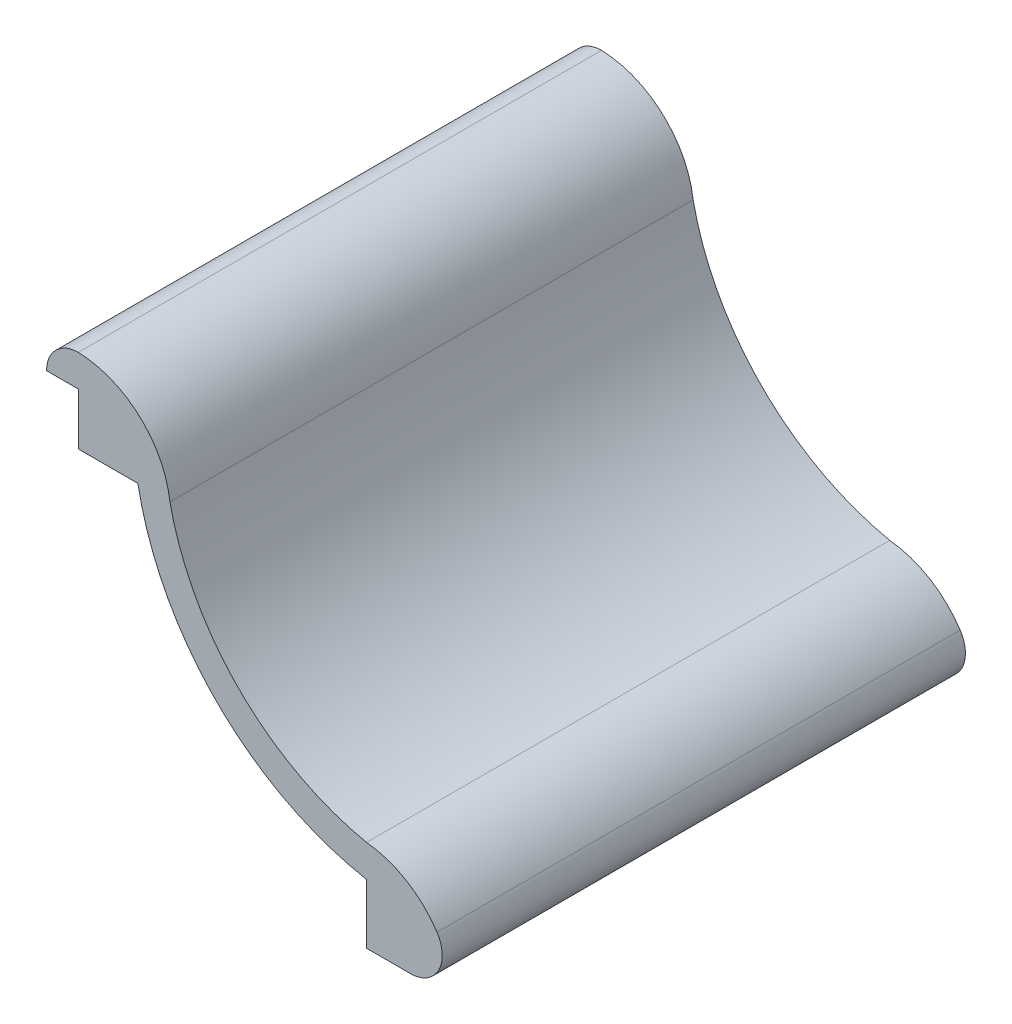
ISO-10303-21;
HEADER;
FILE_DESCRIPTION(('STEP AP214'),'2;1');
FILE_NAME('part.step','',(''),(''),'','','');
FILE_SCHEMA(('AUTOMOTIVE_DESIGN { 1 0 10303 214 1 1 1 1 }'));
ENDSEC;
DATA;
#1=APPLICATION_CONTEXT('core data for automotive mechanical design processes');
#2=APPLICATION_PROTOCOL_DEFINITION('international standard','automotive_design',2000,#1);
#3=PRODUCT_CONTEXT('',#1,'mechanical');
#4=PRODUCT('Part','Part','',(#3));
#5=PRODUCT_RELATED_PRODUCT_CATEGORY('part','',(#4));
#6=PRODUCT_DEFINITION_FORMATION('','',#4);
#7=PRODUCT_DEFINITION_CONTEXT('part definition',#1,'design');
#8=PRODUCT_DEFINITION('design','',#6,#7);
#9=PRODUCT_DEFINITION_SHAPE('','',#8);
#10=(LENGTH_UNIT() NAMED_UNIT(*) SI_UNIT(.MILLI.,.METRE.));
#11=(NAMED_UNIT(*) PLANE_ANGLE_UNIT() SI_UNIT($,.RADIAN.));
#12=(NAMED_UNIT(*) SI_UNIT($,.STERADIAN.) SOLID_ANGLE_UNIT());
#13=UNCERTAINTY_MEASURE_WITH_UNIT(LENGTH_MEASURE(1.E-05),#10,'distance_accuracy_value','');
#14=(GEOMETRIC_REPRESENTATION_CONTEXT(3) GLOBAL_UNCERTAINTY_ASSIGNED_CONTEXT((#13)) GLOBAL_UNIT_ASSIGNED_CONTEXT((#10,
#11,#12)) REPRESENTATION_CONTEXT('',''));
#15=CARTESIAN_POINT('',(0.,0.,0.));
#16=DIRECTION('',(0.,0.,1.));
#17=DIRECTION('',(1.,0.,0.));
#18=AXIS2_PLACEMENT_3D('',#15,#16,#17);
#19=CARTESIAN_POINT('',(-3.15197105507584,-11.938,-104.775));
#20=DIRECTION('',(0.,1.,0.));
#21=DIRECTION('',(0.,0.,1.));
#22=AXIS2_PLACEMENT_3D('',#19,#20,#21);
#23=PLANE('',#22);
#24=DIRECTION('',(-1.,0.,0.));
#25=VECTOR('',#24,1.);
#26=CARTESIAN_POINT('',(-3.15197105507584,-11.938,0.));
#27=LINE('',#26,#25);
#28=CARTESIAN_POINT('',(8.80657813501905,-11.938,0.));
#29=VERTEX_POINT('',#28);
#30=CARTESIAN_POINT('',(0.,-11.938,0.));
#31=VERTEX_POINT('',#30);
#32=EDGE_CURVE('E235',#29,#31,#27,.T.);
#33=ORIENTED_EDGE('',*,*,#32,.F.);
#34=DIRECTION('',(0.,0.,1.));
#35=VECTOR('',#34,1.);
#36=CARTESIAN_POINT('',(8.80657813501905,-11.938,104.775));
#37=LINE('',#36,#35);
#38=CARTESIAN_POINT('',(8.80657813501905,-11.938,92.5957));
#39=VERTEX_POINT('',#38);
#40=EDGE_CURVE('E325',#29,#39,#37,.T.);
#41=ORIENTED_EDGE('',*,*,#40,.T.);
#42=DIRECTION('',(1.,0.,0.));
#43=VECTOR('',#42,1.);
#44=CARTESIAN_POINT('',(-1.80789407603243,-11.938,92.5957));
#45=LINE('',#44,#43);
#46=CARTESIAN_POINT('',(0.,-11.938,92.5957));
#47=VERTEX_POINT('',#46);
#48=EDGE_CURVE('E243',#47,#39,#45,.T.);
#49=ORIENTED_EDGE('',*,*,#48,.F.);
#50=DIRECTION('',(0.,0.,1.));
#51=VECTOR('',#50,1.);
#52=CARTESIAN_POINT('',(0.,-11.938,92.5957));
#53=LINE('',#52,#51);
#54=EDGE_CURVE('E246',#31,#47,#53,.T.);
#55=ORIENTED_EDGE('',*,*,#54,.F.);
#56=EDGE_LOOP('',(#33,#41,#49,#55));
#57=FACE_BOUND('',#56,.T.);
#58=ADVANCED_FACE('F60',(#57),#23,.F.);
#59=CARTESIAN_POINT('',(-57.7342,44.7636331488296,-104.775));
#60=DIRECTION('',(1.,0.,0.));
#61=DIRECTION('',(0.,0.,-1.));
#62=AXIS2_PLACEMENT_3D('',#59,#60,#61);
#63=PLANE('',#62);
#64=DIRECTION('',(0.,0.,1.));
#65=VECTOR('',#64,1.);
#66=CARTESIAN_POINT('',(-57.7342,56.197173041991,0.));
#67=LINE('',#66,#65);
#68=CARTESIAN_POINT('',(-57.7342,56.197173041991,0.));
#69=VERTEX_POINT('',#68);
#70=CARTESIAN_POINT('',(-57.7342,56.197173041991,92.5957));
#71=VERTEX_POINT('',#70);
#72=EDGE_CURVE('E199',#69,#71,#67,.T.);
#73=ORIENTED_EDGE('',*,*,#72,.F.);
#74=DIRECTION('',(0.,1.,0.));
#75=VECTOR('',#74,1.);
#76=CARTESIAN_POINT('',(-57.7342,44.7636331488296,0.));
#77=LINE('',#76,#75);
#78=CARTESIAN_POINT('',(-57.7342,45.796198295609,0.));
#79=VERTEX_POINT('',#78);
#80=EDGE_CURVE('E215',#79,#69,#77,.T.);
#81=ORIENTED_EDGE('',*,*,#80,.F.);
#82=DIRECTION('',(0.,0.,-1.));
#83=VECTOR('',#82,1.);
#84=CARTESIAN_POINT('',(-57.7342,45.796198295609,92.5957));
#85=LINE('',#84,#83);
#86=CARTESIAN_POINT('',(-57.7342,45.796198295609,92.5957));
#87=VERTEX_POINT('',#86);
#88=EDGE_CURVE('E256',#87,#79,#85,.T.);
#89=ORIENTED_EDGE('',*,*,#88,.F.);
#90=DIRECTION('',(0.,-1.,0.));
#91=VECTOR('',#90,1.);
#92=CARTESIAN_POINT('',(-57.7342,43.4795574980974,92.5957));
#93=LINE('',#92,#91);
#94=EDGE_CURVE('E253',#71,#87,#93,.T.);
#95=ORIENTED_EDGE('',*,*,#94,.F.);
#96=EDGE_LOOP('',(#73,#81,#89,#95));
#97=FACE_BOUND('',#96,.T.);
#98=ADVANCED_FACE('F374',(#97),#63,.F.);
#99=CARTESIAN_POINT('',(-57.7342,56.197173041991,98.425));
#100=VERTEX_POINT('',#99);
#101=CARTESIAN_POINT('',(-57.7342,56.197173041991,104.775));
#102=VERTEX_POINT('',#101);
#103=EDGE_CURVE('E322',#100,#102,#67,.T.);
#104=ORIENTED_EDGE('',*,*,#103,.F.);
#105=DIRECTION('',(0.,-1.,0.));
#106=VECTOR('',#105,1.);
#107=CARTESIAN_POINT('',(-57.7342,43.479557498097,98.425));
#108=LINE('',#107,#106);
#109=CARTESIAN_POINT('',(-57.7342,45.796198295609,98.425));
#110=VERTEX_POINT('',#109);
#111=EDGE_CURVE('E319',#100,#110,#108,.T.);
#112=ORIENTED_EDGE('',*,*,#111,.T.);
#113=DIRECTION('',(0.,0.,1.));
#114=VECTOR('',#113,1.);
#115=CARTESIAN_POINT('',(-57.7342,45.796198365176,98.425));
#116=LINE('',#115,#114);
#117=CARTESIAN_POINT('',(-57.7342,45.7961983303925,104.775));
#118=VERTEX_POINT('',#117);
#119=EDGE_CURVE('E248',#110,#118,#116,.T.);
#120=ORIENTED_EDGE('',*,*,#119,.T.);
#121=DIRECTION('',(0.,1.,0.));
#122=VECTOR('',#121,1.);
#123=CARTESIAN_POINT('',(-57.7342,44.7636331488296,104.775));
#124=LINE('',#123,#122);
#125=EDGE_CURVE('E238',#118,#102,#124,.T.);
#126=ORIENTED_EDGE('',*,*,#125,.T.);
#127=EDGE_LOOP('',(#104,#112,#120,#126));
#128=FACE_BOUND('',#127,.T.);
#129=ADVANCED_FACE('F424',(#128),#63,.F.);
#130=CARTESIAN_POINT('',(10.3996216396257,56.1958216396257,104.775));
#131=DIRECTION('',(0.,0.,-1.));
#132=DIRECTION('',(-1.,0.,0.));
#133=AXIS2_PLACEMENT_3D('',#130,#131,#132);
#134=CYLINDRICAL_SURFACE('',#133,50.8493081391342);
#135=DIRECTION('',(0.,0.,-1.));
#136=VECTOR('',#135,1.);
#137=CARTESIAN_POINT('',(0.,6.42133010047239,104.775));
#138=LINE('',#137,#136);
#139=CARTESIAN_POINT('',(0.,6.42133010047239,104.775));
#140=VERTEX_POINT('',#139);
#141=CARTESIAN_POINT('',(0.,6.42133010047239,0.));
#142=VERTEX_POINT('',#141);
#143=EDGE_CURVE('E302',#140,#142,#138,.T.);
#144=ORIENTED_EDGE('',*,*,#143,.T.);
#145=CARTESIAN_POINT('',(10.3996216396257,56.1958216396257,0.));
#146=DIRECTION('',(0.,0.,-1.));
#147=DIRECTION('',(-1.,0.,0.));
#148=AXIS2_PLACEMENT_3D('',#145,#146,#147);
#149=CIRCLE('',#148,50.8493081391342);
#150=CARTESIAN_POINT('',(-39.3748698995276,45.7962,0.));
#151=VERTEX_POINT('',#150);
#152=EDGE_CURVE('E228',#142,#151,#149,.T.);
#153=ORIENTED_EDGE('',*,*,#152,.T.);
#154=DIRECTION('',(0.,0.,-1.));
#155=VECTOR('',#154,1.);
#156=CARTESIAN_POINT('',(-39.3748698995276,45.7962,104.775));
#157=LINE('',#156,#155);
#158=CARTESIAN_POINT('',(-39.3748698995276,45.7962,104.775));
#159=VERTEX_POINT('',#158);
#160=EDGE_CURVE('E303',#159,#151,#157,.T.);
#161=ORIENTED_EDGE('',*,*,#160,.F.);
#162=CARTESIAN_POINT('',(10.3996216396257,56.1958216396257,104.775));
#163=DIRECTION('',(0.,0.,1.));
#164=DIRECTION('',(1.,0.,0.));
#165=AXIS2_PLACEMENT_3D('',#162,#163,#164);
#166=CIRCLE('',#165,50.8493081391342);
#167=EDGE_CURVE('E292',#159,#140,#166,.T.);
#168=ORIENTED_EDGE('',*,*,#167,.T.);
#169=EDGE_LOOP('',(#144,#153,#161,#168));
#170=FACE_BOUND('',#169,.T.);
#171=ADVANCED_FACE('F396',(#170),#134,.F.);
#172=CARTESIAN_POINT('',(-58.3144927056739,43.4795574980971,104.775));
#173=DIRECTION('',(0.,0.,-1.));
#174=DIRECTION('',(-1.,0.,0.));
#175=AXIS2_PLACEMENT_3D('',#172,#173,#174);
#176=CYLINDRICAL_SURFACE('',#175,19.0807794526513);
#177=ORIENTED_EDGE('',*,*,#160,.T.);
#178=CARTESIAN_POINT('',(-58.3144927056739,43.4795574980971,0.));
#179=DIRECTION('',(0.,0.,-1.));
#180=DIRECTION('',(-1.,0.,0.));
#181=AXIS2_PLACEMENT_3D('',#178,#179,#180);
#182=CIRCLE('',#181,19.0807794526513);
#183=CARTESIAN_POINT('',(-57.7342,62.5515108562736,0.));
#184=VERTEX_POINT('',#183);
#185=EDGE_CURVE('E225',#151,#184,#182,.F.);
#186=ORIENTED_EDGE('',*,*,#185,.T.);
#187=DIRECTION('',(0.,0.,-1.));
#188=VECTOR('',#187,1.);
#189=CARTESIAN_POINT('',(-57.7342,62.5515108562736,104.775));
#190=LINE('',#189,#188);
#191=CARTESIAN_POINT('',(-57.7342,62.5515108562736,104.775));
#192=VERTEX_POINT('',#191);
#193=EDGE_CURVE('E259',#192,#184,#190,.T.);
#194=ORIENTED_EDGE('',*,*,#193,.F.);
#195=CARTESIAN_POINT('',(-58.3144927056739,43.4795574980971,104.775));
#196=DIRECTION('',(0.,0.,-1.));
#197=DIRECTION('',(-1.,0.,0.));
#198=AXIS2_PLACEMENT_3D('',#195,#196,#197);
#199=CIRCLE('',#198,19.0807794526513);
#200=EDGE_CURVE('E300',#192,#159,#199,.T.);
#201=ORIENTED_EDGE('',*,*,#200,.T.);
#202=EDGE_LOOP('',(#177,#186,#194,#201));
#203=FACE_BOUND('',#202,.T.);
#204=ADVANCED_FACE('F391',(#203),#176,.T.);
#205=CARTESIAN_POINT('',(10.3996216396257,56.1958216396257,104.775));
#206=DIRECTION('',(0.,0.,-1.));
#207=DIRECTION('',(-1.,0.,0.));
#208=AXIS2_PLACEMENT_3D('',#205,#206,#207);
#209=CYLINDRICAL_SURFACE('',#208,57.15);
#210=DIRECTION('',(0.,0.,-1.));
#211=VECTOR('',#210,1.);
#212=CARTESIAN_POINT('',(-45.7961996845846,45.796198295609,92.5957));
#213=LINE('',#212,#211);
#214=CARTESIAN_POINT('',(-45.7961996845846,45.796198295609,92.5957));
#215=VERTEX_POINT('',#214);
#216=CARTESIAN_POINT('',(-45.7961996845846,45.796198295609,0.));
#217=VERTEX_POINT('',#216);
#218=EDGE_CURVE('E289',#215,#217,#213,.T.);
#219=ORIENTED_EDGE('',*,*,#218,.T.);
#220=CARTESIAN_POINT('',(10.3996216396257,56.1958216396257,0.));
#221=DIRECTION('',(0.,0.,-1.));
#222=DIRECTION('',(-1.,0.,0.));
#223=AXIS2_PLACEMENT_3D('',#220,#221,#222);
#224=CIRCLE('',#223,57.15);
#225=CARTESIAN_POINT('',(0.,0.,0.));
#226=VERTEX_POINT('',#225);
#227=EDGE_CURVE('E218',#217,#226,#224,.F.);
#228=ORIENTED_EDGE('',*,*,#227,.T.);
#229=DIRECTION('',(0.,0.,-1.));
#230=VECTOR('',#229,1.);
#231=CARTESIAN_POINT('',(0.,0.,92.5957));
#232=LINE('',#231,#230);
#233=CARTESIAN_POINT('',(0.,0.,92.5957));
#234=VERTEX_POINT('',#233);
#235=EDGE_CURVE('E281',#234,#226,#232,.T.);
#236=ORIENTED_EDGE('',*,*,#235,.F.);
#237=DIRECTION('',(0.,0.,-1.));
#238=VECTOR('',#237,1.);
#239=CARTESIAN_POINT('',(0.,0.,104.775));
#240=LINE('',#239,#238);
#241=CARTESIAN_POINT('',(0.,0.,98.425));
#242=VERTEX_POINT('',#241);
#243=EDGE_CURVE('E314',#242,#234,#240,.T.);
#244=ORIENTED_EDGE('',*,*,#243,.F.);
#245=CARTESIAN_POINT('',(0.,0.,104.775));
#246=VERTEX_POINT('',#245);
#247=EDGE_CURVE('E311',#246,#242,#240,.T.);
#248=ORIENTED_EDGE('',*,*,#247,.F.);
#249=CARTESIAN_POINT('',(10.3996216396257,56.1958216396257,104.775));
#250=DIRECTION('',(0.,0.,-1.));
#251=DIRECTION('',(-1.,0.,0.));
#252=AXIS2_PLACEMENT_3D('',#249,#250,#251);
#253=CIRCLE('',#252,57.15);
#254=CARTESIAN_POINT('',(-45.7962,45.7962,104.775));
#255=VERTEX_POINT('',#254);
#256=EDGE_CURVE('E297',#246,#255,#253,.T.);
#257=ORIENTED_EDGE('',*,*,#256,.T.);
#258=DIRECTION('',(0.,0.,-1.));
#259=VECTOR('',#258,1.);
#260=CARTESIAN_POINT('',(-45.7962,45.7962,104.775));
#261=LINE('',#260,#259);
#262=CARTESIAN_POINT('',(-45.7962,45.7962,98.425));
#263=VERTEX_POINT('',#262);
#264=EDGE_CURVE('E307',#255,#263,#261,.T.);
#265=ORIENTED_EDGE('',*,*,#264,.T.);
#266=EDGE_CURVE('E310',#263,#215,#261,.T.);
#267=ORIENTED_EDGE('',*,*,#266,.T.);
#268=EDGE_LOOP('',(#219,#228,#236,#244,#248,#257,#265,#267));
#269=FACE_BOUND('',#268,.T.);
#270=ADVANCED_FACE('F365',(#269),#209,.T.);
#271=CARTESIAN_POINT('',(-1.87934056653368,-12.6385492205695,104.775));
#272=DIRECTION('',(0.,0.,-1.));
#273=DIRECTION('',(-1.,0.,0.));
#274=AXIS2_PLACEMENT_3D('',#271,#272,#273);
#275=CYLINDRICAL_SURFACE('',#274,19.1523084952624);
#276=CARTESIAN_POINT('',(-1.87934056653368,-12.6385492205695,104.775));
#277=DIRECTION('',(0.,0.,-1.));
#278=DIRECTION('',(-1.,0.,0.));
#279=AXIS2_PLACEMENT_3D('',#276,#277,#278);
#280=CIRCLE('',#279,19.1523084952624);
#281=CARTESIAN_POINT('',(14.106839707373,-2.09089730424912,104.775));
#282=VERTEX_POINT('',#281);
#283=EDGE_CURVE('E295',#140,#282,#280,.T.);
#284=ORIENTED_EDGE('',*,*,#283,.T.);
#285=DIRECTION('',(0.,0.,-1.));
#286=VECTOR('',#285,1.);
#287=CARTESIAN_POINT('',(14.106839707373,-2.09089730424912,104.775));
#288=LINE('',#287,#286);
#289=CARTESIAN_POINT('',(14.106839707373,-2.09089730424912,0.));
#290=VERTEX_POINT('',#289);
#291=EDGE_CURVE('E82',#282,#290,#288,.T.);
#292=ORIENTED_EDGE('',*,*,#291,.T.);
#293=CARTESIAN_POINT('',(-1.87934056653368,-12.6385492205695,0.));
#294=DIRECTION('',(0.,0.,-1.));
#295=DIRECTION('',(-1.,0.,0.));
#296=AXIS2_PLACEMENT_3D('',#293,#294,#295);
#297=CIRCLE('',#296,19.1523084952624);
#298=EDGE_CURVE('E233',#290,#142,#297,.F.);
#299=ORIENTED_EDGE('',*,*,#298,.T.);
#300=ORIENTED_EDGE('',*,*,#143,.F.);
#301=EDGE_LOOP('',(#284,#292,#299,#300));
#302=FACE_BOUND('',#301,.T.);
#303=ADVANCED_FACE('F397',(#302),#275,.T.);
#304=CARTESIAN_POINT('',(-58.2422,45.796198295609,92.5957));
#305=DIRECTION('',(0.,1.,0.));
#306=DIRECTION('',(-1.,0.,0.));
#307=AXIS2_PLACEMENT_3D('',#304,#305,#306);
#308=PLANE('',#307);
#309=DIRECTION('',(-1.,0.,0.));
#310=VECTOR('',#309,1.);
#311=CARTESIAN_POINT('',(-58.2422,45.796198295609,0.));
#312=LINE('',#311,#310);
#313=EDGE_CURVE('E216',#217,#79,#312,.T.);
#314=ORIENTED_EDGE('',*,*,#313,.F.);
#315=ORIENTED_EDGE('',*,*,#218,.F.);
#316=DIRECTION('',(1.,0.,0.));
#317=VECTOR('',#316,1.);
#318=CARTESIAN_POINT('',(-58.2422,45.796198295609,92.5957));
#319=LINE('',#318,#317);
#320=EDGE_CURVE('E287',#87,#215,#319,.T.);
#321=ORIENTED_EDGE('',*,*,#320,.F.);
#322=ORIENTED_EDGE('',*,*,#88,.T.);
#323=EDGE_LOOP('',(#314,#315,#321,#322));
#324=FACE_BOUND('',#323,.T.);
#325=ADVANCED_FACE('F370',(#324),#308,.F.);
#326=CARTESIAN_POINT('',(0.,0.,92.5957));
#327=DIRECTION('',(1.,0.,0.));
#328=DIRECTION('',(0.,1.,0.));
#329=AXIS2_PLACEMENT_3D('',#326,#327,#328);
#330=PLANE('',#329);
#331=DIRECTION('',(0.,1.,0.));
#332=VECTOR('',#331,1.);
#333=CARTESIAN_POINT('',(0.,0.,0.));
#334=LINE('',#333,#332);
#335=EDGE_CURVE('E231',#31,#226,#334,.T.);
#336=ORIENTED_EDGE('',*,*,#335,.F.);
#337=ORIENTED_EDGE('',*,*,#54,.T.);
#338=DIRECTION('',(0.,-1.,0.));
#339=VECTOR('',#338,1.);
#340=CARTESIAN_POINT('',(0.,0.,92.5957));
#341=LINE('',#340,#339);
#342=EDGE_CURVE('E278',#234,#47,#341,.T.);
#343=ORIENTED_EDGE('',*,*,#342,.F.);
#344=ORIENTED_EDGE('',*,*,#235,.T.);
#345=EDGE_LOOP('',(#336,#337,#343,#344));
#346=FACE_BOUND('',#345,.T.);
#347=ADVANCED_FACE('F364',(#346),#330,.F.);
#348=DIRECTION('',(1.,0.,0.));
#349=VECTOR('',#348,1.);
#350=CARTESIAN_POINT('',(-1.80789407603247,-11.938,98.425));
#351=LINE('',#350,#349);
#352=CARTESIAN_POINT('',(0.,-11.938,98.425));
#353=VERTEX_POINT('',#352);
#354=CARTESIAN_POINT('',(8.80657813501905,-11.938,98.425));
#355=VERTEX_POINT('',#354);
#356=EDGE_CURVE('E306',#353,#355,#351,.T.);
#357=ORIENTED_EDGE('',*,*,#356,.T.);
#358=DIRECTION('',(0.,0.,1.));
#359=VECTOR('',#358,1.);
#360=CARTESIAN_POINT('',(8.80657813501905,-11.938,104.775));
#361=LINE('',#360,#359);
#362=CARTESIAN_POINT('',(8.80657813501905,-11.938,104.775));
#363=VERTEX_POINT('',#362);
#364=EDGE_CURVE('E323',#355,#363,#361,.T.);
#365=ORIENTED_EDGE('',*,*,#364,.T.);
#366=DIRECTION('',(-1.,0.,0.));
#367=VECTOR('',#366,1.);
#368=CARTESIAN_POINT('',(-3.15197105507584,-11.938,104.775));
#369=LINE('',#368,#367);
#370=CARTESIAN_POINT('',(0.,-11.938,104.775));
#371=VERTEX_POINT('',#370);
#372=EDGE_CURVE('E237',#363,#371,#369,.T.);
#373=ORIENTED_EDGE('',*,*,#372,.T.);
#374=DIRECTION('',(0.,0.,-1.));
#375=VECTOR('',#374,1.);
#376=CARTESIAN_POINT('',(0.,-11.938,98.425));
#377=LINE('',#376,#375);
#378=EDGE_CURVE('E240',#371,#353,#377,.T.);
#379=ORIENTED_EDGE('',*,*,#378,.T.);
#380=EDGE_LOOP('',(#357,#365,#373,#379));
#381=FACE_BOUND('',#380,.T.);
#382=ADVANCED_FACE('F403',(#381),#23,.F.);
#383=CARTESIAN_POINT('',(-1.80789407603234,-12.601825413661,104.775));
#384=DIRECTION('',(0.,0.,-1.));
#385=DIRECTION('',(-1.,0.,0.));
#386=AXIS2_PLACEMENT_3D('',#383,#384,#385);
#387=CYLINDRICAL_SURFACE('',#386,12.7308477622877);
#388=CARTESIAN_POINT('',(-1.80789407603243,-12.6018254136611,92.5957));
#389=DIRECTION('',(0.,0.,1.));
#390=DIRECTION('',(-1.,0.,0.));
#391=AXIS2_PLACEMENT_3D('',#388,#389,#390);
#392=CIRCLE('',#391,12.7308477622878);
#393=CARTESIAN_POINT('',(10.8826052233487,-11.589050868683,92.5957));
#394=VERTEX_POINT('',#393);
#395=EDGE_CURVE('E275',#394,#234,#392,.T.);
#396=ORIENTED_EDGE('',*,*,#395,.F.);
#397=DIRECTION('',(0.,0.,-1.));
#398=VECTOR('',#397,1.);
#399=CARTESIAN_POINT('',(10.8826052233487,-11.589050868683,92.5957));
#400=LINE('',#399,#398);
#401=CARTESIAN_POINT('',(10.8826052233487,-11.589050868683,98.425));
#402=VERTEX_POINT('',#401);
#403=EDGE_CURVE('E330',#394,#402,#400,.F.);
#404=ORIENTED_EDGE('',*,*,#403,.T.);
#405=CARTESIAN_POINT('',(-1.80789407603247,-12.6018254136611,98.425));
#406=DIRECTION('',(0.,0.,1.));
#407=DIRECTION('',(-1.,0.,0.));
#408=AXIS2_PLACEMENT_3D('',#405,#406,#407);
#409=CIRCLE('',#408,12.7308477622878);
#410=EDGE_CURVE('E262',#402,#242,#409,.T.);
#411=ORIENTED_EDGE('',*,*,#410,.T.);
#412=ORIENTED_EDGE('',*,*,#243,.T.);
#413=EDGE_LOOP('',(#396,#404,#411,#412));
#414=FACE_BOUND('',#413,.T.);
#415=ADVANCED_FACE('F356',(#414),#387,.F.);
#416=CARTESIAN_POINT('',(-58.3144927056739,43.4795574980971,104.775));
#417=DIRECTION('',(0.,0.,-1.));
#418=DIRECTION('',(-1.,0.,0.));
#419=AXIS2_PLACEMENT_3D('',#416,#417,#418);
#420=CYLINDRICAL_SURFACE('',#419,12.7308477622879);
#421=DIRECTION('',(0.,0.,-1.));
#422=VECTOR('',#421,1.);
#423=CARTESIAN_POINT('',(-57.7342,56.197173041991,104.775));
#424=LINE('',#423,#422);
#425=EDGE_CURVE('E250',#71,#100,#424,.F.);
#426=ORIENTED_EDGE('',*,*,#425,.F.);
#427=CARTESIAN_POINT('',(-58.3144927056737,43.4795574980974,92.5957));
#428=DIRECTION('',(0.,0.,1.));
#429=DIRECTION('',(-1.,0.,0.));
#430=AXIS2_PLACEMENT_3D('',#427,#428,#429);
#431=CIRCLE('',#430,12.7308477622876);
#432=EDGE_CURVE('E284',#215,#71,#431,.T.);
#433=ORIENTED_EDGE('',*,*,#432,.F.);
#434=ORIENTED_EDGE('',*,*,#266,.F.);
#435=CARTESIAN_POINT('',(-58.3144927056739,43.479557498097,98.425));
#436=DIRECTION('',(0.,0.,1.));
#437=DIRECTION('',(-1.,0.,0.));
#438=AXIS2_PLACEMENT_3D('',#435,#436,#437);
#439=CIRCLE('',#438,12.7308477622879);
#440=EDGE_CURVE('E270',#263,#100,#439,.T.);
#441=ORIENTED_EDGE('',*,*,#440,.T.);
#442=EDGE_LOOP('',(#426,#433,#434,#441));
#443=FACE_BOUND('',#442,.T.);
#444=ADVANCED_FACE('F431',(#443),#420,.F.);
#445=CARTESIAN_POINT('',(10.3996216396257,56.1958216396257,104.775));
#446=DIRECTION('',(0.,0.,1.));
#447=DIRECTION('',(1.,0.,0.));
#448=AXIS2_PLACEMENT_3D('',#445,#446,#447);
#449=PLANE('',#448);
#450=ORIENTED_EDGE('',*,*,#372,.F.);
#451=CARTESIAN_POINT('',(8.80657813501905,-5.588,104.775));
#452=DIRECTION('',(0.,0.,1.));
#453=DIRECTION('',(1.,0.,0.));
#454=AXIS2_PLACEMENT_3D('',#451,#452,#453);
#455=CIRCLE('',#454,6.35);
#456=EDGE_CURVE('E336',#363,#282,#455,.T.);
#457=ORIENTED_EDGE('',*,*,#456,.T.);
#458=ORIENTED_EDGE('',*,*,#283,.F.);
#459=ORIENTED_EDGE('',*,*,#167,.F.);
#460=ORIENTED_EDGE('',*,*,#200,.F.);
#461=CARTESIAN_POINT('',(-57.7342,56.2015108562736,104.775));
#462=DIRECTION('',(0.,0.,1.));
#463=DIRECTION('',(1.,0.,0.));
#464=AXIS2_PLACEMENT_3D('',#461,#462,#463);
#465=CIRCLE('',#464,6.35);
#466=CARTESIAN_POINT('',(-64.0842,56.2015108562736,104.775));
#467=VERTEX_POINT('',#466);
#468=EDGE_CURVE('E334',#192,#467,#465,.T.);
#469=ORIENTED_EDGE('',*,*,#468,.T.);
#470=DIRECTION('',(0.,1.,0.));
#471=VECTOR('',#470,1.);
#472=CARTESIAN_POINT('',(-64.0842,62.5515108562736,104.775));
#473=LINE('',#472,#471);
#474=CARTESIAN_POINT('',(-64.0842,56.197173041991,104.775));
#475=VERTEX_POINT('',#474);
#476=EDGE_CURVE('E210',#475,#467,#473,.T.);
#477=ORIENTED_EDGE('',*,*,#476,.F.);
#478=DIRECTION('',(1.,0.,0.));
#479=VECTOR('',#478,1.);
#480=CARTESIAN_POINT('',(-64.0842,56.197173041991,104.775));
#481=LINE('',#480,#479);
#482=EDGE_CURVE('E208',#475,#102,#481,.T.);
#483=ORIENTED_EDGE('',*,*,#482,.T.);
#484=ORIENTED_EDGE('',*,*,#125,.F.);
#485=DIRECTION('',(0.999999999999991,1.36942867347279E-07,0.));
#486=VECTOR('',#485,1.);
#487=CARTESIAN_POINT('',(-58.2422,45.796198295609,104.775));
#488=LINE('',#487,#486);
#489=EDGE_CURVE('E267',#118,#255,#488,.T.);
#490=ORIENTED_EDGE('',*,*,#489,.T.);
#491=ORIENTED_EDGE('',*,*,#256,.F.);
#492=DIRECTION('',(0.,-1.,0.));
#493=VECTOR('',#492,1.);
#494=CARTESIAN_POINT('',(0.,0.,104.775));
#495=LINE('',#494,#493);
#496=EDGE_CURVE('E261',#246,#371,#495,.T.);
#497=ORIENTED_EDGE('',*,*,#496,.T.);
#498=EDGE_LOOP('',(#450,#457,#458,#459,#460,#469,#477,#483,#484,#490,#491,#497));
#499=FACE_BOUND('',#498,.T.);
#500=ADVANCED_FACE('F386',(#499),#449,.T.);
#501=CARTESIAN_POINT('',(-58.3144927056737,43.4795574980974,92.5957));
#502=DIRECTION('',(0.,0.,-1.));
#503=DIRECTION('',(-1.,0.,0.));
#504=AXIS2_PLACEMENT_3D('',#501,#502,#503);
#505=PLANE('',#504);
#506=ORIENTED_EDGE('',*,*,#432,.T.);
#507=ORIENTED_EDGE('',*,*,#94,.T.);
#508=ORIENTED_EDGE('',*,*,#320,.T.);
#509=EDGE_LOOP('',(#506,#507,#508));
#510=FACE_BOUND('',#509,.T.);
#511=ADVANCED_FACE('F377',(#510),#505,.F.);
#512=CARTESIAN_POINT('',(-1.80789407603243,-12.6018254136611,92.5957));
#513=DIRECTION('',(0.,0.,-1.));
#514=DIRECTION('',(-1.,0.,0.));
#515=AXIS2_PLACEMENT_3D('',#512,#513,#514);
#516=PLANE('',#515);
#517=ORIENTED_EDGE('',*,*,#48,.T.);
#518=CARTESIAN_POINT('',(8.80657813501905,-5.588,92.5957));
#519=DIRECTION('',(0.,0.,-1.));
#520=DIRECTION('',(-1.,0.,0.));
#521=AXIS2_PLACEMENT_3D('',#518,#519,#520);
#522=CIRCLE('',#521,6.35);
#523=EDGE_CURVE('E328',#39,#394,#522,.F.);
#524=ORIENTED_EDGE('',*,*,#523,.T.);
#525=ORIENTED_EDGE('',*,*,#395,.T.);
#526=ORIENTED_EDGE('',*,*,#342,.T.);
#527=EDGE_LOOP('',(#517,#524,#525,#526));
#528=FACE_BOUND('',#527,.T.);
#529=ADVANCED_FACE('F353',(#528),#516,.F.);
#530=CARTESIAN_POINT('',(-58.2422,45.796198295609,98.425));
#531=DIRECTION('',(1.36942867347279E-07,-0.999999999999991,0.));
#532=DIRECTION('',(0.999999999999991,1.36942867347279E-07,0.));
#533=AXIS2_PLACEMENT_3D('',#530,#531,#532);
#534=PLANE('',#533);
#535=ORIENTED_EDGE('',*,*,#119,.F.);
#536=DIRECTION('',(0.999999999999991,1.36942867347279E-07,0.));
#537=VECTOR('',#536,1.);
#538=CARTESIAN_POINT('',(-58.2422,45.796198295609,98.425));
#539=LINE('',#538,#537);
#540=EDGE_CURVE('E273',#110,#263,#539,.T.);
#541=ORIENTED_EDGE('',*,*,#540,.T.);
#542=ORIENTED_EDGE('',*,*,#264,.F.);
#543=ORIENTED_EDGE('',*,*,#489,.F.);
#544=EDGE_LOOP('',(#535,#541,#542,#543));
#545=FACE_BOUND('',#544,.T.);
#546=ADVANCED_FACE('F559',(#545),#534,.T.);
#547=CARTESIAN_POINT('',(-58.3144927056739,43.479557498097,98.425));
#548=DIRECTION('',(0.,0.,-1.));
#549=DIRECTION('',(-1.,0.,0.));
#550=AXIS2_PLACEMENT_3D('',#547,#548,#549);
#551=PLANE('',#550);
#552=ORIENTED_EDGE('',*,*,#111,.F.);
#553=ORIENTED_EDGE('',*,*,#440,.F.);
#554=ORIENTED_EDGE('',*,*,#540,.F.);
#555=EDGE_LOOP('',(#552,#553,#554));
#556=FACE_BOUND('',#555,.T.);
#557=ADVANCED_FACE('F417',(#556),#551,.T.);
#558=CARTESIAN_POINT('',(0.,0.,98.425));
#559=DIRECTION('',(-1.,0.,0.));
#560=DIRECTION('',(0.,-1.,0.));
#561=AXIS2_PLACEMENT_3D('',#558,#559,#560);
#562=PLANE('',#561);
#563=ORIENTED_EDGE('',*,*,#378,.F.);
#564=ORIENTED_EDGE('',*,*,#496,.F.);
#565=ORIENTED_EDGE('',*,*,#247,.T.);
#566=DIRECTION('',(0.,-1.,0.));
#567=VECTOR('',#566,1.);
#568=CARTESIAN_POINT('',(0.,0.,98.425));
#569=LINE('',#568,#567);
#570=EDGE_CURVE('E264',#242,#353,#569,.T.);
#571=ORIENTED_EDGE('',*,*,#570,.T.);
#572=EDGE_LOOP('',(#563,#564,#565,#571));
#573=FACE_BOUND('',#572,.T.);
#574=ADVANCED_FACE('F406',(#573),#562,.T.);
#575=CARTESIAN_POINT('',(-1.80789407603247,-12.6018254136611,98.425));
#576=DIRECTION('',(0.,0.,-1.));
#577=DIRECTION('',(-1.,0.,0.));
#578=AXIS2_PLACEMENT_3D('',#575,#576,#577);
#579=PLANE('',#578);
#580=ORIENTED_EDGE('',*,*,#410,.F.);
#581=CARTESIAN_POINT('',(8.80657813501905,-5.588,98.425));
#582=DIRECTION('',(0.,0.,-1.));
#583=DIRECTION('',(-1.,0.,0.));
#584=AXIS2_PLACEMENT_3D('',#581,#582,#583);
#585=CIRCLE('',#584,6.35);
#586=EDGE_CURVE('E332',#402,#355,#585,.T.);
#587=ORIENTED_EDGE('',*,*,#586,.T.);
#588=ORIENTED_EDGE('',*,*,#356,.F.);
#589=ORIENTED_EDGE('',*,*,#570,.F.);
#590=EDGE_LOOP('',(#580,#587,#588,#589));
#591=FACE_BOUND('',#590,.T.);
#592=ADVANCED_FACE('F409',(#591),#579,.T.);
#593=CARTESIAN_POINT('',(0.,0.,0.));
#594=DIRECTION('',(0.,0.,-1.));
#595=DIRECTION('',(-1.,0.,0.));
#596=AXIS2_PLACEMENT_3D('',#593,#594,#595);
#597=PLANE('',#596);
#598=ORIENTED_EDGE('',*,*,#298,.F.);
#599=CARTESIAN_POINT('',(8.80657813501905,-5.588,0.));
#600=DIRECTION('',(0.,0.,-1.));
#601=DIRECTION('',(-1.,0.,0.));
#602=AXIS2_PLACEMENT_3D('',#599,#600,#601);
#603=CIRCLE('',#602,6.35);
#604=EDGE_CURVE('E68',#290,#29,#603,.T.);
#605=ORIENTED_EDGE('',*,*,#604,.T.);
#606=ORIENTED_EDGE('',*,*,#32,.T.);
#607=ORIENTED_EDGE('',*,*,#335,.T.);
#608=ORIENTED_EDGE('',*,*,#227,.F.);
#609=ORIENTED_EDGE('',*,*,#313,.T.);
#610=ORIENTED_EDGE('',*,*,#80,.T.);
#611=DIRECTION('',(1.,0.,0.));
#612=VECTOR('',#611,1.);
#613=CARTESIAN_POINT('',(-64.0842,56.197173041991,0.));
#614=LINE('',#613,#612);
#615=CARTESIAN_POINT('',(-64.0842,56.197173041991,0.));
#616=VERTEX_POINT('',#615);
#617=EDGE_CURVE('E205',#616,#69,#614,.T.);
#618=ORIENTED_EDGE('',*,*,#617,.F.);
#619=DIRECTION('',(0.,-1.,0.));
#620=VECTOR('',#619,1.);
#621=CARTESIAN_POINT('',(-64.0842,62.5515108562736,0.));
#622=LINE('',#621,#620);
#623=CARTESIAN_POINT('',(-64.0842,56.2015108562736,0.));
#624=VERTEX_POINT('',#623);
#625=EDGE_CURVE('E191',#624,#616,#622,.T.);
#626=ORIENTED_EDGE('',*,*,#625,.F.);
#627=CARTESIAN_POINT('',(-57.7342,56.2015108562736,0.));
#628=DIRECTION('',(0.,0.,-1.));
#629=DIRECTION('',(-1.,0.,0.));
#630=AXIS2_PLACEMENT_3D('',#627,#628,#629);
#631=CIRCLE('',#630,6.35);
#632=EDGE_CURVE('E75',#624,#184,#631,.T.);
#633=ORIENTED_EDGE('',*,*,#632,.T.);
#634=ORIENTED_EDGE('',*,*,#185,.F.);
#635=ORIENTED_EDGE('',*,*,#152,.F.);
#636=EDGE_LOOP('',(#598,#605,#606,#607,#608,#609,#610,#618,#626,#633,#634,#635));
#637=FACE_BOUND('',#636,.T.);
#638=ADVANCED_FACE('F213',(#637),#597,.T.);
#639=CARTESIAN_POINT('',(-64.0842,56.197173041991,0.));
#640=DIRECTION('',(0.,1.,0.));
#641=DIRECTION('',(0.,0.,1.));
#642=AXIS2_PLACEMENT_3D('',#639,#640,#641);
#643=PLANE('',#642);
#644=ORIENTED_EDGE('',*,*,#72,.T.);
#645=ORIENTED_EDGE('',*,*,#425,.T.);
#646=ORIENTED_EDGE('',*,*,#103,.T.);
#647=ORIENTED_EDGE('',*,*,#482,.F.);
#648=DIRECTION('',(0.,0.,1.));
#649=VECTOR('',#648,1.);
#650=CARTESIAN_POINT('',(-64.0842,56.197173041991,0.));
#651=LINE('',#650,#649);
#652=EDGE_CURVE('E195',#616,#475,#651,.T.);
#653=ORIENTED_EDGE('',*,*,#652,.F.);
#654=ORIENTED_EDGE('',*,*,#617,.T.);
#655=EDGE_LOOP('',(#644,#645,#646,#647,#653,#654));
#656=FACE_BOUND('',#655,.T.);
#657=ADVANCED_FACE('F204',(#656),#643,.F.);
#658=CARTESIAN_POINT('',(-64.0842,0.,0.));
#659=DIRECTION('',(-1.,0.,0.));
#660=DIRECTION('',(0.,0.,1.));
#661=AXIS2_PLACEMENT_3D('',#658,#659,#660);
#662=PLANE('',#661);
#663=ORIENTED_EDGE('',*,*,#476,.T.);
#664=DIRECTION('',(0.,0.,-1.));
#665=VECTOR('',#664,1.);
#666=CARTESIAN_POINT('',(-64.0842,56.2015108562736,0.));
#667=LINE('',#666,#665);
#668=EDGE_CURVE('E15',#467,#624,#667,.T.);
#669=ORIENTED_EDGE('',*,*,#668,.T.);
#670=ORIENTED_EDGE('',*,*,#625,.T.);
#671=ORIENTED_EDGE('',*,*,#652,.T.);
#672=EDGE_LOOP('',(#663,#669,#670,#671));
#673=FACE_BOUND('',#672,.T.);
#674=ADVANCED_FACE('F194',(#673),#662,.T.);
#675=CARTESIAN_POINT('',(8.80657813501905,-5.588,104.775));
#676=DIRECTION('',(0.,0.,-1.));
#677=DIRECTION('',(-1.,0.,0.));
#678=AXIS2_PLACEMENT_3D('',#675,#676,#677);
#679=CYLINDRICAL_SURFACE('',#678,6.35);
#680=ORIENTED_EDGE('',*,*,#604,.F.);
#681=ORIENTED_EDGE('',*,*,#291,.F.);
#682=ORIENTED_EDGE('',*,*,#456,.F.);
#683=ORIENTED_EDGE('',*,*,#364,.F.);
#684=ORIENTED_EDGE('',*,*,#586,.F.);
#685=ORIENTED_EDGE('',*,*,#403,.F.);
#686=ORIENTED_EDGE('',*,*,#523,.F.);
#687=ORIENTED_EDGE('',*,*,#40,.F.);
#688=EDGE_LOOP('',(#680,#681,#682,#683,#684,#685,#686,#687));
#689=FACE_BOUND('',#688,.T.);
#690=ADVANCED_FACE('F348',(#689),#679,.T.);
#691=CARTESIAN_POINT('',(-57.7342,56.2015108562736,0.));
#692=DIRECTION('',(0.,0.,1.));
#693=DIRECTION('',(1.,0.,0.));
#694=AXIS2_PLACEMENT_3D('',#691,#692,#693);
#695=CYLINDRICAL_SURFACE('',#694,6.35);
#696=ORIENTED_EDGE('',*,*,#468,.F.);
#697=ORIENTED_EDGE('',*,*,#193,.T.);
#698=ORIENTED_EDGE('',*,*,#632,.F.);
#699=ORIENTED_EDGE('',*,*,#668,.F.);
#700=EDGE_LOOP('',(#696,#697,#698,#699));
#701=FACE_BOUND('',#700,.T.);
#702=ADVANCED_FACE('F62',(#701),#695,.T.);
#703=CLOSED_SHELL('',(#58,#98,#129,#171,#204,#270,#303,#325,#347,#382,#415,#444,#500,#511,#529,
#546,#557,#574,#592,#638,#657,#674,#690,#702));
#704=MANIFOLD_SOLID_BREP('B2',#703);
#705=ADVANCED_BREP_SHAPE_REPRESENTATION('',(#18,#704),#14);
#706=SHAPE_DEFINITION_REPRESENTATION(#9,#705);
ENDSEC;
END-ISO-10303-21;
